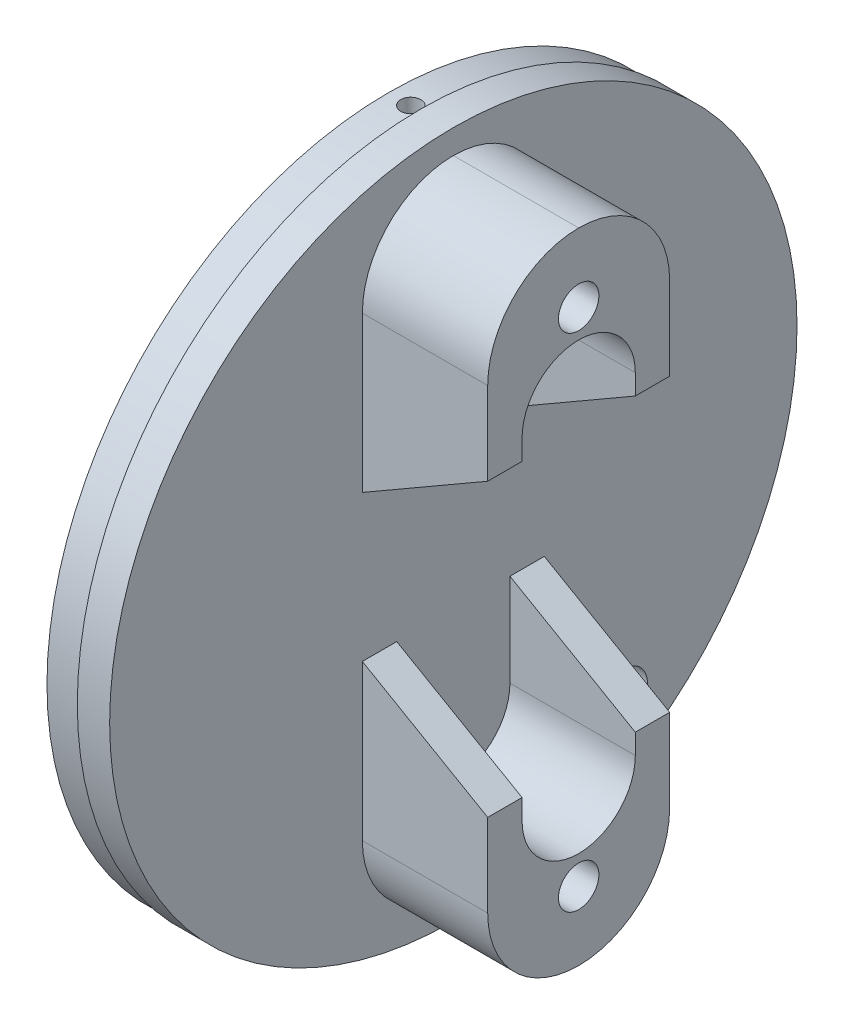
ISO-10303-21;
HEADER;
FILE_DESCRIPTION(('STEP AP214'),'2;1');
FILE_NAME('part.step','',(''),(''),'','','');
FILE_SCHEMA(('AUTOMOTIVE_DESIGN { 1 0 10303 214 1 1 1 1 }'));
ENDSEC;
DATA;
#1=APPLICATION_CONTEXT('core data for automotive mechanical design processes');
#2=APPLICATION_PROTOCOL_DEFINITION('international standard','automotive_design',2000,#1);
#3=PRODUCT_CONTEXT('',#1,'mechanical');
#4=PRODUCT('Part','Part','',(#3));
#5=PRODUCT_RELATED_PRODUCT_CATEGORY('part','',(#4));
#6=PRODUCT_DEFINITION_FORMATION('','',#4);
#7=PRODUCT_DEFINITION_CONTEXT('part definition',#1,'design');
#8=PRODUCT_DEFINITION('design','',#6,#7);
#9=PRODUCT_DEFINITION_SHAPE('','',#8);
#10=(LENGTH_UNIT() NAMED_UNIT(*) SI_UNIT(.MILLI.,.METRE.));
#11=(NAMED_UNIT(*) PLANE_ANGLE_UNIT() SI_UNIT($,.RADIAN.));
#12=(NAMED_UNIT(*) SI_UNIT($,.STERADIAN.) SOLID_ANGLE_UNIT());
#13=UNCERTAINTY_MEASURE_WITH_UNIT(LENGTH_MEASURE(1.E-05),#10,'distance_accuracy_value','');
#14=(GEOMETRIC_REPRESENTATION_CONTEXT(3) GLOBAL_UNCERTAINTY_ASSIGNED_CONTEXT((#13)) GLOBAL_UNIT_ASSIGNED_CONTEXT((#10,
#11,#12)) REPRESENTATION_CONTEXT('',''));
#15=CARTESIAN_POINT('',(0.,0.,0.));
#16=DIRECTION('',(0.,0.,1.));
#17=DIRECTION('',(1.,0.,0.));
#18=AXIS2_PLACEMENT_3D('',#15,#16,#17);
#19=CARTESIAN_POINT('',(15.5,0.,0.));
#20=DIRECTION('',(-1.,0.,0.));
#21=DIRECTION('',(0.,0.,1.));
#22=AXIS2_PLACEMENT_3D('',#19,#20,#21);
#23=PLANE('',#22);
#24=CARTESIAN_POINT('',(15.5,-31.,0.));
#25=DIRECTION('',(-1.,0.,0.));
#26=DIRECTION('',(0.,0.,1.));
#27=AXIS2_PLACEMENT_3D('',#24,#25,#26);
#28=CIRCLE('',#27,2.5);
#29=CARTESIAN_POINT('',(15.5,-31.,2.49999999999999));
#30=VERTEX_POINT('',#29);
#31=EDGE_CURVE('E215',#30,#30,#28,.T.);
#32=ORIENTED_EDGE('',*,*,#31,.T.);
#33=EDGE_LOOP('',(#32));
#34=FACE_BOUND('',#33,.T.);
#35=DIRECTION('',(0.,-1.,0.));
#36=VECTOR('',#35,1.);
#37=CARTESIAN_POINT('',(15.5,20.5,6.99999999999999));
#38=LINE('',#37,#36);
#39=CARTESIAN_POINT('',(15.5,-17.9989291724391,6.99999999999999));
#40=VERTEX_POINT('',#39);
#41=CARTESIAN_POINT('',(15.5,-20.5,6.99999999999999));
#42=VERTEX_POINT('',#41);
#43=EDGE_CURVE('E221',#40,#42,#38,.T.);
#44=ORIENTED_EDGE('',*,*,#43,.F.);
#45=DIRECTION('',(0.,0.,1.));
#46=VECTOR('',#45,1.);
#47=CARTESIAN_POINT('',(15.5,-17.9989291724392,0.));
#48=LINE('',#47,#46);
#49=CARTESIAN_POINT('',(15.5,-17.9989291724391,11.25));
#50=VERTEX_POINT('',#49);
#51=EDGE_CURVE('E348',#40,#50,#48,.T.);
#52=ORIENTED_EDGE('',*,*,#51,.T.);
#53=DIRECTION('',(0.,-1.,0.));
#54=VECTOR('',#53,1.);
#55=CARTESIAN_POINT('',(15.5,-39.5,11.25));
#56=LINE('',#55,#54);
#57=CARTESIAN_POINT('',(15.5,-28.25,11.25));
#58=VERTEX_POINT('',#57);
#59=EDGE_CURVE('E277',#50,#58,#56,.T.);
#60=ORIENTED_EDGE('',*,*,#59,.T.);
#61=CARTESIAN_POINT('',(15.5,-28.25,0.));
#62=DIRECTION('',(-1.,0.,0.));
#63=DIRECTION('',(0.,0.,1.));
#64=AXIS2_PLACEMENT_3D('',#61,#62,#63);
#65=CIRCLE('',#64,11.25);
#66=CARTESIAN_POINT('',(15.5,-39.5,0.));
#67=VERTEX_POINT('',#66);
#68=EDGE_CURVE('E320',#58,#67,#65,.F.);
#69=ORIENTED_EDGE('',*,*,#68,.T.);
#70=CARTESIAN_POINT('',(15.5,-28.25,0.));
#71=DIRECTION('',(-1.,0.,0.));
#72=DIRECTION('',(0.,0.,1.));
#73=AXIS2_PLACEMENT_3D('',#70,#71,#72);
#74=CIRCLE('',#73,11.25);
#75=CARTESIAN_POINT('',(15.5,-28.25,-11.25));
#76=VERTEX_POINT('',#75);
#77=EDGE_CURVE('E322',#67,#76,#74,.F.);
#78=ORIENTED_EDGE('',*,*,#77,.T.);
#79=DIRECTION('',(0.,1.,0.));
#80=VECTOR('',#79,1.);
#81=CARTESIAN_POINT('',(15.5,-39.5,-11.25));
#82=LINE('',#81,#80);
#83=CARTESIAN_POINT('',(15.5,-17.9989291724391,-11.25));
#84=VERTEX_POINT('',#83);
#85=EDGE_CURVE('E278',#76,#84,#82,.T.);
#86=ORIENTED_EDGE('',*,*,#85,.T.);
#87=CARTESIAN_POINT('',(15.5,-17.9989291724391,-7.));
#88=VERTEX_POINT('',#87);
#89=EDGE_CURVE('E349',#84,#88,#48,.T.);
#90=ORIENTED_EDGE('',*,*,#89,.T.);
#91=DIRECTION('',(0.,1.,0.));
#92=VECTOR('',#91,1.);
#93=CARTESIAN_POINT('',(15.5,20.5,-7.));
#94=LINE('',#93,#92);
#95=CARTESIAN_POINT('',(15.5,-20.5,-7.));
#96=VERTEX_POINT('',#95);
#97=EDGE_CURVE('E227',#96,#88,#94,.T.);
#98=ORIENTED_EDGE('',*,*,#97,.F.);
#99=CARTESIAN_POINT('',(15.5,-20.5,0.));
#100=DIRECTION('',(1.,0.,0.));
#101=DIRECTION('',(0.,0.,-1.));
#102=AXIS2_PLACEMENT_3D('',#99,#100,#101);
#103=CIRCLE('',#102,7.);
#104=EDGE_CURVE('E224',#42,#96,#103,.T.);
#105=ORIENTED_EDGE('',*,*,#104,.F.);
#106=EDGE_LOOP('',(#44,#52,#60,#69,#78,#86,#90,#98,#105));
#107=FACE_BOUND('',#106,.T.);
#108=ADVANCED_FACE('F51',(#34,#107),#23,.F.);
#109=CARTESIAN_POINT('',(15.5,31.,0.));
#110=DIRECTION('',(-1.,0.,0.));
#111=DIRECTION('',(0.,0.,1.));
#112=AXIS2_PLACEMENT_3D('',#109,#110,#111);
#113=CIRCLE('',#112,2.5);
#114=CARTESIAN_POINT('',(15.5,31.,2.49999999999999));
#115=VERTEX_POINT('',#114);
#116=EDGE_CURVE('E209',#115,#115,#113,.T.);
#117=ORIENTED_EDGE('',*,*,#116,.T.);
#118=EDGE_LOOP('',(#117));
#119=FACE_BOUND('',#118,.T.);
#120=CARTESIAN_POINT('',(15.5,20.5,6.99999999999999));
#121=VERTEX_POINT('',#120);
#122=CARTESIAN_POINT('',(15.5,17.9989291724391,6.99999999999999));
#123=VERTEX_POINT('',#122);
#124=EDGE_CURVE('E222',#121,#123,#38,.T.);
#125=ORIENTED_EDGE('',*,*,#124,.F.);
#126=CARTESIAN_POINT('',(15.5,20.5,0.));
#127=DIRECTION('',(1.,0.,0.));
#128=DIRECTION('',(0.,0.,-1.));
#129=AXIS2_PLACEMENT_3D('',#126,#127,#128);
#130=CIRCLE('',#129,7.);
#131=CARTESIAN_POINT('',(15.5,20.5,-7.));
#132=VERTEX_POINT('',#131);
#133=EDGE_CURVE('E219',#132,#121,#130,.T.);
#134=ORIENTED_EDGE('',*,*,#133,.F.);
#135=CARTESIAN_POINT('',(15.5,17.9989291724391,-7.));
#136=VERTEX_POINT('',#135);
#137=EDGE_CURVE('E226',#136,#132,#94,.T.);
#138=ORIENTED_EDGE('',*,*,#137,.F.);
#139=DIRECTION('',(0.,0.,-1.));
#140=VECTOR('',#139,1.);
#141=CARTESIAN_POINT('',(15.5,17.9989291724392,0.));
#142=LINE('',#141,#140);
#143=CARTESIAN_POINT('',(15.5,17.9989291724392,-11.25));
#144=VERTEX_POINT('',#143);
#145=EDGE_CURVE('E339',#136,#144,#142,.T.);
#146=ORIENTED_EDGE('',*,*,#145,.T.);
#147=CARTESIAN_POINT('',(15.5,28.25,-11.25));
#148=VERTEX_POINT('',#147);
#149=EDGE_CURVE('E276',#144,#148,#82,.T.);
#150=ORIENTED_EDGE('',*,*,#149,.T.);
#151=CARTESIAN_POINT('',(15.5,28.25,0.));
#152=DIRECTION('',(-1.,0.,0.));
#153=DIRECTION('',(0.,0.,1.));
#154=AXIS2_PLACEMENT_3D('',#151,#152,#153);
#155=CIRCLE('',#154,11.25);
#156=CARTESIAN_POINT('',(15.5,39.5,0.));
#157=VERTEX_POINT('',#156);
#158=EDGE_CURVE('E318',#148,#157,#155,.F.);
#159=ORIENTED_EDGE('',*,*,#158,.T.);
#160=CARTESIAN_POINT('',(15.5,28.25,0.));
#161=DIRECTION('',(-1.,0.,0.));
#162=DIRECTION('',(0.,0.,1.));
#163=AXIS2_PLACEMENT_3D('',#160,#161,#162);
#164=CIRCLE('',#163,11.25);
#165=CARTESIAN_POINT('',(15.5,28.25,11.25));
#166=VERTEX_POINT('',#165);
#167=EDGE_CURVE('E316',#157,#166,#164,.F.);
#168=ORIENTED_EDGE('',*,*,#167,.T.);
#169=CARTESIAN_POINT('',(15.5,17.9989291724391,11.25));
#170=VERTEX_POINT('',#169);
#171=EDGE_CURVE('E273',#166,#170,#56,.T.);
#172=ORIENTED_EDGE('',*,*,#171,.T.);
#173=EDGE_CURVE('E345',#170,#123,#142,.T.);
#174=ORIENTED_EDGE('',*,*,#173,.T.);
#175=EDGE_LOOP('',(#125,#134,#138,#146,#150,#159,#168,#172,#174));
#176=FACE_BOUND('',#175,.T.);
#177=ADVANCED_FACE('F394',(#119,#176),#23,.F.);
#178=CARTESIAN_POINT('',(15.5,-17.9989291724391,-42.5));
#179=DIRECTION('',(-0.499999999999998,-0.86602540378444,0.));
#180=DIRECTION('',(0.86602540378444,-0.499999999999998,0.));
#181=AXIS2_PLACEMENT_3D('',#178,#179,#180);
#182=PLANE('',#181);
#183=DIRECTION('',(0.86602540378444,-0.499999999999998,0.));
#184=VECTOR('',#183,1.);
#185=CARTESIAN_POINT('',(15.5,-17.9989291724391,6.99999999999999));
#186=LINE('',#185,#184);
#187=CARTESIAN_POINT('',(0.,-9.05,6.99999999999999));
#188=VERTEX_POINT('',#187);
#189=EDGE_CURVE('E250',#188,#40,#186,.T.);
#190=ORIENTED_EDGE('',*,*,#189,.F.);
#191=DIRECTION('',(0.,0.,1.));
#192=VECTOR('',#191,1.);
#193=CARTESIAN_POINT('',(0.,-9.05,-42.5));
#194=LINE('',#193,#192);
#195=CARTESIAN_POINT('',(0.,-9.05,11.25));
#196=VERTEX_POINT('',#195);
#197=EDGE_CURVE('E257',#188,#196,#194,.T.);
#198=ORIENTED_EDGE('',*,*,#197,.T.);
#199=DIRECTION('',(-0.86602540378444,0.499999999999998,0.));
#200=VECTOR('',#199,1.);
#201=CARTESIAN_POINT('',(24.810236772618,-23.3741968793293,11.25));
#202=LINE('',#201,#200);
#203=EDGE_CURVE('E269',#50,#196,#202,.T.);
#204=ORIENTED_EDGE('',*,*,#203,.F.);
#205=ORIENTED_EDGE('',*,*,#51,.F.);
#206=EDGE_LOOP('',(#190,#198,#204,#205));
#207=FACE_BOUND('',#206,.T.);
#208=ADVANCED_FACE('F399',(#207),#182,.F.);
#209=DIRECTION('',(-0.86602540378444,0.499999999999998,0.));
#210=VECTOR('',#209,1.);
#211=CARTESIAN_POINT('',(15.5,-17.9989291724391,-7.00000000000001));
#212=LINE('',#211,#210);
#213=CARTESIAN_POINT('',(0.,-9.05,-7.00000000000001));
#214=VERTEX_POINT('',#213);
#215=EDGE_CURVE('E248',#88,#214,#212,.T.);
#216=ORIENTED_EDGE('',*,*,#215,.F.);
#217=ORIENTED_EDGE('',*,*,#89,.F.);
#218=DIRECTION('',(0.86602540378444,-0.499999999999998,0.));
#219=VECTOR('',#218,1.);
#220=CARTESIAN_POINT('',(24.810236772618,-23.3741968793293,-11.25));
#221=LINE('',#220,#219);
#222=CARTESIAN_POINT('',(0.,-9.05,-11.25));
#223=VERTEX_POINT('',#222);
#224=EDGE_CURVE('E266',#223,#84,#221,.T.);
#225=ORIENTED_EDGE('',*,*,#224,.F.);
#226=EDGE_CURVE('E253',#223,#214,#194,.T.);
#227=ORIENTED_EDGE('',*,*,#226,.T.);
#228=EDGE_LOOP('',(#216,#217,#225,#227));
#229=FACE_BOUND('',#228,.T.);
#230=ADVANCED_FACE('F423',(#229),#182,.F.);
#231=CARTESIAN_POINT('',(0.,9.05,-42.5));
#232=DIRECTION('',(-0.499999999999998,0.86602540378444,0.));
#233=DIRECTION('',(-0.86602540378444,-0.499999999999998,0.));
#234=AXIS2_PLACEMENT_3D('',#231,#232,#233);
#235=PLANE('',#234);
#236=DIRECTION('',(-0.86602540378444,-0.499999999999998,0.));
#237=VECTOR('',#236,1.);
#238=CARTESIAN_POINT('',(0.,9.05,6.99999999999999));
#239=LINE('',#238,#237);
#240=CARTESIAN_POINT('',(0.,9.05,6.99999999999999));
#241=VERTEX_POINT('',#240);
#242=EDGE_CURVE('E64',#123,#241,#239,.T.);
#243=ORIENTED_EDGE('',*,*,#242,.F.);
#244=ORIENTED_EDGE('',*,*,#173,.F.);
#245=DIRECTION('',(0.86602540378444,0.499999999999998,0.));
#246=VECTOR('',#245,1.);
#247=CARTESIAN_POINT('',(-9.39776667686721,3.62419687932946,11.25));
#248=LINE('',#247,#246);
#249=CARTESIAN_POINT('',(0.,9.05,11.25));
#250=VERTEX_POINT('',#249);
#251=EDGE_CURVE('E263',#250,#170,#248,.T.);
#252=ORIENTED_EDGE('',*,*,#251,.F.);
#253=DIRECTION('',(0.,0.,1.));
#254=VECTOR('',#253,1.);
#255=CARTESIAN_POINT('',(0.,9.05,-42.5));
#256=LINE('',#255,#254);
#257=EDGE_CURVE('E252',#241,#250,#256,.T.);
#258=ORIENTED_EDGE('',*,*,#257,.F.);
#259=EDGE_LOOP('',(#243,#244,#252,#258));
#260=FACE_BOUND('',#259,.T.);
#261=ADVANCED_FACE('F425',(#260),#235,.F.);
#262=DIRECTION('',(0.86602540378444,0.499999999999998,0.));
#263=VECTOR('',#262,1.);
#264=CARTESIAN_POINT('',(0.,9.05,-7.00000000000001));
#265=LINE('',#264,#263);
#266=CARTESIAN_POINT('',(0.,9.05,-7.));
#267=VERTEX_POINT('',#266);
#268=EDGE_CURVE('E352',#267,#136,#265,.T.);
#269=ORIENTED_EDGE('',*,*,#268,.F.);
#270=CARTESIAN_POINT('',(0.,9.05,-11.25));
#271=VERTEX_POINT('',#270);
#272=EDGE_CURVE('E258',#271,#267,#256,.T.);
#273=ORIENTED_EDGE('',*,*,#272,.F.);
#274=DIRECTION('',(-0.86602540378444,-0.499999999999998,0.));
#275=VECTOR('',#274,1.);
#276=CARTESIAN_POINT('',(-9.39776667686721,3.62419687932946,-11.25));
#277=LINE('',#276,#275);
#278=EDGE_CURVE('E256',#144,#271,#277,.T.);
#279=ORIENTED_EDGE('',*,*,#278,.F.);
#280=ORIENTED_EDGE('',*,*,#145,.F.);
#281=EDGE_LOOP('',(#269,#273,#279,#280));
#282=FACE_BOUND('',#281,.T.);
#283=ADVANCED_FACE('F428',(#282),#235,.F.);
#284=CARTESIAN_POINT('',(15.5,-39.5,11.25));
#285=DIRECTION('',(0.,0.,-1.));
#286=DIRECTION('',(-1.,0.,0.));
#287=AXIS2_PLACEMENT_3D('',#284,#285,#286);
#288=PLANE('',#287);
#289=ORIENTED_EDGE('',*,*,#59,.F.);
#290=ORIENTED_EDGE('',*,*,#203,.T.);
#291=DIRECTION('',(0.,-1.,0.));
#292=VECTOR('',#291,1.);
#293=CARTESIAN_POINT('',(0.,-39.5,11.25));
#294=LINE('',#293,#292);
#295=CARTESIAN_POINT('',(0.,-28.25,11.25));
#296=VERTEX_POINT('',#295);
#297=EDGE_CURVE('E286',#196,#296,#294,.T.);
#298=ORIENTED_EDGE('',*,*,#297,.T.);
#299=DIRECTION('',(-1.,0.,0.));
#300=VECTOR('',#299,1.);
#301=CARTESIAN_POINT('',(15.5,-28.25,11.25));
#302=LINE('',#301,#300);
#303=EDGE_CURVE('E326',#296,#58,#302,.F.);
#304=ORIENTED_EDGE('',*,*,#303,.T.);
#305=EDGE_LOOP('',(#289,#290,#298,#304));
#306=FACE_BOUND('',#305,.T.);
#307=ADVANCED_FACE('F386',(#306),#288,.F.);
#308=CARTESIAN_POINT('',(15.5,-39.5,-11.25));
#309=DIRECTION('',(0.,0.,1.));
#310=DIRECTION('',(1.,0.,0.));
#311=AXIS2_PLACEMENT_3D('',#308,#309,#310);
#312=PLANE('',#311);
#313=DIRECTION('',(0.,1.,0.));
#314=VECTOR('',#313,1.);
#315=CARTESIAN_POINT('',(0.,-39.5,-11.25));
#316=LINE('',#315,#314);
#317=CARTESIAN_POINT('',(0.,-28.25,-11.25));
#318=VERTEX_POINT('',#317);
#319=EDGE_CURVE('E287',#318,#223,#316,.T.);
#320=ORIENTED_EDGE('',*,*,#319,.T.);
#321=ORIENTED_EDGE('',*,*,#224,.T.);
#322=ORIENTED_EDGE('',*,*,#85,.F.);
#323=DIRECTION('',(-1.,0.,0.));
#324=VECTOR('',#323,1.);
#325=CARTESIAN_POINT('',(15.5,-28.25,-11.25));
#326=LINE('',#325,#324);
#327=EDGE_CURVE('E313',#76,#318,#326,.T.);
#328=ORIENTED_EDGE('',*,*,#327,.T.);
#329=EDGE_LOOP('',(#320,#321,#322,#328));
#330=FACE_BOUND('',#329,.T.);
#331=ADVANCED_FACE('F376',(#330),#312,.F.);
#332=CARTESIAN_POINT('',(-714.885574261404,0.,0.));
#333=DIRECTION('',(-1.,0.,0.));
#334=DIRECTION('',(0.,0.,1.));
#335=AXIS2_PLACEMENT_3D('',#332,#333,#334);
#336=CYLINDRICAL_SURFACE('',#335,42.5);
#337=CARTESIAN_POINT('',(-4.,0.,0.));
#338=DIRECTION('',(-1.,0.,0.));
#339=DIRECTION('',(0.,0.,1.));
#340=AXIS2_PLACEMENT_3D('',#337,#338,#339);
#341=CIRCLE('',#340,42.5);
#342=CARTESIAN_POINT('',(-4.,0.,42.5));
#343=VERTEX_POINT('',#342);
#344=EDGE_CURVE('E292',#343,#343,#341,.T.);
#345=ORIENTED_EDGE('',*,*,#344,.F.);
#346=EDGE_LOOP('',(#345));
#347=FACE_BOUND('',#346,.T.);
#348=CARTESIAN_POINT('',(0.,0.,0.));
#349=DIRECTION('',(1.,0.,0.));
#350=DIRECTION('',(0.,0.,-1.));
#351=AXIS2_PLACEMENT_3D('',#348,#349,#350);
#352=CIRCLE('',#351,42.5);
#353=CARTESIAN_POINT('',(0.,0.,-42.5));
#354=VERTEX_POINT('',#353);
#355=EDGE_CURVE('E281',#354,#354,#352,.T.);
#356=ORIENTED_EDGE('',*,*,#355,.F.);
#357=EDGE_LOOP('',(#356));
#358=FACE_BOUND('',#357,.T.);
#359=ADVANCED_FACE('F373',(#347,#358),#336,.T.);
#360=CARTESIAN_POINT('',(-8.00000000000004,16.,0.));
#361=DIRECTION('',(1.,0.,0.));
#362=DIRECTION('',(0.,0.,-1.));
#363=AXIS2_PLACEMENT_3D('',#360,#361,#362);
#364=PLANE('',#363);
#365=CARTESIAN_POINT('',(-8.00000000000004,-29.,-21.));
#366=DIRECTION('',(-1.,0.,0.));
#367=DIRECTION('',(0.,0.,1.));
#368=AXIS2_PLACEMENT_3D('',#365,#366,#367);
#369=CIRCLE('',#368,3.);
#370=CARTESIAN_POINT('',(-8.00000000000004,-29.,-18.));
#371=VERTEX_POINT('',#370);
#372=EDGE_CURVE('E196',#371,#371,#369,.T.);
#373=ORIENTED_EDGE('',*,*,#372,.F.);
#374=EDGE_LOOP('',(#373));
#375=FACE_BOUND('',#374,.T.);
#376=CARTESIAN_POINT('',(-8.00000000000004,20.5,0.));
#377=DIRECTION('',(1.,0.,0.));
#378=DIRECTION('',(0.,0.,-1.));
#379=AXIS2_PLACEMENT_3D('',#376,#377,#378);
#380=CIRCLE('',#379,6.5);
#381=CARTESIAN_POINT('',(-8.00000000000004,20.5,-6.5));
#382=VERTEX_POINT('',#381);
#383=EDGE_CURVE('E307',#382,#382,#380,.T.);
#384=ORIENTED_EDGE('',*,*,#383,.T.);
#385=EDGE_LOOP('',(#384));
#386=FACE_BOUND('',#385,.T.);
#387=CARTESIAN_POINT('',(-8.00000000000001,0.,0.));
#388=DIRECTION('',(-1.,0.,0.));
#389=DIRECTION('',(0.,0.,1.));
#390=AXIS2_PLACEMENT_3D('',#387,#388,#389);
#391=CIRCLE('',#390,42.25);
#392=CARTESIAN_POINT('',(-8.00000000000001,0.,42.25));
#393=VERTEX_POINT('',#392);
#394=EDGE_CURVE('E298',#393,#393,#391,.T.);
#395=ORIENTED_EDGE('',*,*,#394,.T.);
#396=EDGE_LOOP('',(#395));
#397=FACE_BOUND('',#396,.T.);
#398=ADVANCED_FACE('F375',(#375,#386,#397),#364,.F.);
#399=CARTESIAN_POINT('',(-1017.,20.5,0.));
#400=DIRECTION('',(-1.,0.,0.));
#401=DIRECTION('',(0.,0.,1.));
#402=AXIS2_PLACEMENT_3D('',#399,#400,#401);
#403=CYLINDRICAL_SURFACE('',#402,4.5);
#404=CARTESIAN_POINT('',(-10.,20.5,0.));
#405=DIRECTION('',(1.,0.,0.));
#406=DIRECTION('',(0.,0.,-1.));
#407=AXIS2_PLACEMENT_3D('',#404,#405,#406);
#408=CIRCLE('',#407,4.5);
#409=CARTESIAN_POINT('',(-10.,20.5,-4.5));
#410=VERTEX_POINT('',#409);
#411=EDGE_CURVE('E304',#410,#410,#408,.F.);
#412=ORIENTED_EDGE('',*,*,#411,.T.);
#413=EDGE_LOOP('',(#412));
#414=FACE_BOUND('',#413,.T.);
#415=CARTESIAN_POINT('',(-17.,20.5,0.));
#416=DIRECTION('',(-1.,0.,0.));
#417=DIRECTION('',(0.,0.,1.));
#418=AXIS2_PLACEMENT_3D('',#415,#416,#417);
#419=CIRCLE('',#418,4.5);
#420=CARTESIAN_POINT('',(-17.,20.5,4.5));
#421=VERTEX_POINT('',#420);
#422=EDGE_CURVE('E301',#421,#421,#419,.T.);
#423=ORIENTED_EDGE('',*,*,#422,.F.);
#424=EDGE_LOOP('',(#423));
#425=FACE_BOUND('',#424,.T.);
#426=ADVANCED_FACE('F383',(#414,#425),#403,.T.);
#427=CARTESIAN_POINT('',(-17.,0.,0.));
#428=DIRECTION('',(1.,0.,0.));
#429=DIRECTION('',(0.,0.,-1.));
#430=AXIS2_PLACEMENT_3D('',#427,#428,#429);
#431=PLANE('',#430);
#432=CARTESIAN_POINT('',(-17.,20.5,0.));
#433=DIRECTION('',(-1.,0.,0.));
#434=DIRECTION('',(0.,0.,1.));
#435=AXIS2_PLACEMENT_3D('',#432,#433,#434);
#436=CIRCLE('',#435,1.65);
#437=CARTESIAN_POINT('',(-17.,20.5,1.65));
#438=VERTEX_POINT('',#437);
#439=EDGE_CURVE('E202',#438,#438,#436,.T.);
#440=ORIENTED_EDGE('',*,*,#439,.F.);
#441=EDGE_LOOP('',(#440));
#442=FACE_BOUND('',#441,.T.);
#443=ORIENTED_EDGE('',*,*,#422,.T.);
#444=EDGE_LOOP('',(#443));
#445=FACE_BOUND('',#444,.T.);
#446=ADVANCED_FACE('F404',(#442,#445),#431,.F.);
#447=CARTESIAN_POINT('',(-10.,20.5,0.));
#448=DIRECTION('',(1.,0.,0.));
#449=DIRECTION('',(0.,0.,-1.));
#450=AXIS2_PLACEMENT_3D('',#447,#448,#449);
#451=TOROIDAL_SURFACE('',#450,6.5,2.);
#452=ORIENTED_EDGE('',*,*,#383,.F.);
#453=EDGE_LOOP('',(#452));
#454=FACE_BOUND('',#453,.T.);
#455=ORIENTED_EDGE('',*,*,#411,.F.);
#456=EDGE_LOOP('',(#455));
#457=FACE_BOUND('',#456,.T.);
#458=ADVANCED_FACE('F410',(#454,#457),#451,.F.);
#459=CARTESIAN_POINT('',(-1000.,0.,0.));
#460=DIRECTION('',(-1.,0.,0.));
#461=DIRECTION('',(0.,0.,1.));
#462=AXIS2_PLACEMENT_3D('',#459,#460,#461);
#463=CYLINDRICAL_SURFACE('',#462,42.25);
#464=CARTESIAN_POINT('',(-4.,42.25,0.));
#465=CARTESIAN_POINT('',(-4.00000310788172,42.2499997508496,-0.0701965689448525));
#466=CARTESIAN_POINT('',(-4.00593291760932,42.2498231803283,-0.140443645930583));
#467=CARTESIAN_POINT('',(-4.02950518504546,42.2491357798871,-0.279002028584804));
#468=CARTESIAN_POINT('',(-4.04716163652588,42.2486245506189,-0.347310919680379));
#469=CARTESIAN_POINT('',(-4.09368309495641,42.2473257285401,-0.479965589333422));
#470=CARTESIAN_POINT('',(-4.12254262233644,42.2465382708545,-0.544313287562788));
#471=CARTESIAN_POINT('',(-4.19064316667275,42.2447758175827,-0.66723266967503));
#472=CARTESIAN_POINT('',(-4.22988164807603,42.2438008678162,-0.725805759489601));
#473=CARTESIAN_POINT('',(-4.31764688691388,42.241772722151,-0.835557484223929));
#474=CARTESIAN_POINT('',(-4.36617714815248,42.2407194968276,-0.886733316922135));
#475=CARTESIAN_POINT('',(-4.47114227852571,42.2386537649071,-0.980214275034548));
#476=CARTESIAN_POINT('',(-4.52757746220523,42.2376412599323,-1.0225190472929));
#477=CARTESIAN_POINT('',(-4.6467606896827,42.235771002964,-1.09706125658326));
#478=CARTESIAN_POINT('',(-4.70950977330255,42.2349132765258,-1.12929703177531));
#479=CARTESIAN_POINT('',(-4.83953216710106,42.2334495656459,-1.18277536520727));
#480=CARTESIAN_POINT('',(-4.90680545937857,42.2328435802082,-1.20401796694146));
#481=CARTESIAN_POINT('',(-5.04394565171449,42.2319518930541,-1.23490098588688));
#482=CARTESIAN_POINT('',(-5.11381178147674,42.2316660969884,-1.24454482093372));
#483=CARTESIAN_POINT('',(-5.25417183450939,42.2314467294612,-1.25196708057046));
#484=CARTESIAN_POINT('',(-5.3246657553103,42.2315131566149,-1.24974555181376));
#485=CARTESIAN_POINT('',(-5.46425713748476,42.2319906567979,-1.23350303874063));
#486=CARTESIAN_POINT('',(-5.53335502935515,42.2324016218672,-1.21948575058753));
#487=CARTESIAN_POINT('',(-5.66821647832321,42.2335216998328,-1.18005533462313));
#488=CARTESIAN_POINT('',(-5.73398002818506,42.2342308133761,-1.15464218208294));
#489=CARTESIAN_POINT('',(-5.86031788444766,42.2358673747993,-1.09313718398819));
#490=CARTESIAN_POINT('',(-5.92089136561908,42.2367948573127,-1.05704364428298));
#491=CARTESIAN_POINT('',(-6.03512056342475,42.2387635648866,-0.975203698557491));
#492=CARTESIAN_POINT('',(-6.08877626476317,42.2398047901987,-0.929457271194395));
#493=CARTESIAN_POINT('',(-6.18766834811509,42.2418840864903,-0.829589214288357));
#494=CARTESIAN_POINT('',(-6.23290149306829,42.2429221561067,-0.775464379228466));
#495=CARTESIAN_POINT('',(-6.31363953146802,42.2448777333896,-0.660387226923741));
#496=CARTESIAN_POINT('',(-6.3491444233473,42.2457952410365,-0.599434908578988));
#497=CARTESIAN_POINT('',(-6.40941773202253,42.2474062784324,-0.472431216611692));
#498=CARTESIAN_POINT('',(-6.43418604725617,42.2480998060626,-0.4063797947613));
#499=CARTESIAN_POINT('',(-6.47228105071997,42.249184670388,-0.271053675299346));
#500=CARTESIAN_POINT('',(-6.48560776925514,42.2495760078835,-0.201778986225663));
#501=CARTESIAN_POINT('',(-6.50043731448921,42.25001227608,-0.0620009263782428));
#502=CARTESIAN_POINT('',(-6.50194462004265,42.2500573379986,0.00850196882717335));
#503=CARTESIAN_POINT('',(-6.49310422367055,42.249796323014,0.148759811289308));
#504=CARTESIAN_POINT('',(-6.48275653509168,42.2494902465063,0.218514759387996));
#505=CARTESIAN_POINT('',(-6.45050359166212,42.2485615348425,0.355284121488675));
#506=CARTESIAN_POINT('',(-6.42860037017491,42.2479389553806,0.422299015408173));
#507=CARTESIAN_POINT('',(-6.37386018036968,42.246447394175,0.551700683352557));
#508=CARTESIAN_POINT('',(-6.34102319073515,42.2455784119511,0.614087448354131));
#509=CARTESIAN_POINT('',(-6.26533605795955,42.2436916126367,0.732482533446539));
#510=CARTESIAN_POINT('',(-6.22248290048668,42.2426737507759,0.78848892582387));
#511=CARTESIAN_POINT('',(-6.12798430484172,42.2406040554348,0.892514084882584));
#512=CARTESIAN_POINT('',(-6.0763388447217,42.2395522218696,0.940532831624101));
#513=CARTESIAN_POINT('',(-5.96570248319632,42.2375327861983,1.02723456912516));
#514=CARTESIAN_POINT('',(-5.90670931630027,42.236565210228,1.06591466967981));
#515=CARTESIAN_POINT('',(-5.78306371523946,42.2348237914473,1.13282136118448));
#516=CARTESIAN_POINT('',(-5.7184112936379,42.2340499482068,1.16104797533986));
#517=CARTESIAN_POINT('',(-5.5852933133752,42.2327834309011,1.20624138272467));
#518=CARTESIAN_POINT('',(-5.51682839031089,42.232290710122,1.22321004675498));
#519=CARTESIAN_POINT('',(-5.37801986313499,42.2316418596499,1.24541200952474));
#520=CARTESIAN_POINT('',(-5.30767626053848,42.2314857296855,1.25064531772794));
#521=CARTESIAN_POINT('',(-5.16713611939083,42.2315276810117,1.24922779595364));
#522=CARTESIAN_POINT('',(-5.09693953476585,42.2317256264077,1.2425815253727));
#523=CARTESIAN_POINT('',(-4.95865898768618,42.2324531281373,1.2176028837221));
#524=CARTESIAN_POINT('',(-4.89057502942162,42.2329826851284,1.19927048947603));
#525=CARTESIAN_POINT('',(-4.75845060979864,42.2343136925974,1.15144060236367));
#526=CARTESIAN_POINT('',(-4.69441021633616,42.2351151476393,1.12194292207796));
#527=CARTESIAN_POINT('',(-4.5721920406582,42.2368995673016,1.05262140384099));
#528=CARTESIAN_POINT('',(-4.51401404604093,42.2378825253423,1.01279794019227));
#529=CARTESIAN_POINT('',(-4.40515127071781,42.2399195192912,0.923942028100889));
#530=CARTESIAN_POINT('',(-4.35446857186892,42.2409735748292,0.874907029660887));
#531=CARTESIAN_POINT('',(-4.26204079371808,42.2430340062932,0.769009948165132));
#532=CARTESIAN_POINT('',(-4.2202979308274,42.2440403703472,0.712145929825043));
#533=CARTESIAN_POINT('',(-4.1469278469671,42.2458923191545,0.592183063176233));
#534=CARTESIAN_POINT('',(-4.11530715316131,42.2467378000222,0.529080226020922));
#535=CARTESIAN_POINT('',(-4.06314577920988,42.2481708087843,0.398507631059076));
#536=CARTESIAN_POINT('',(-4.0425918845341,42.2487586441686,0.331043189663896));
#537=CARTESIAN_POINT('',(-4.01859537320425,42.2494529929848,0.219293737761477));
#538=CARTESIAN_POINT('',(-4.01163088056802,42.2496572307493,0.175734091850095));
#539=CARTESIAN_POINT('',(-4.0023322190201,42.2499308124494,0.0881229334312929));
#540=CARTESIAN_POINT('',(-3.99999804878265,42.2500001564238,0.0440714210647098));
#541=CARTESIAN_POINT('',(-4.,42.25,0.));
#542=B_SPLINE_CURVE_WITH_KNOTS('',3,(#464,#465,#466,#467,#468,#469,#470,#471,#472,#473,#474,
#475,#476,#477,#478,#479,#480,#481,#482,#483,#484,#485,#486,#487,#488,#489,#490,#491,#492,#493,
#494,#495,#496,#497,#498,#499,#500,#501,#502,#503,#504,#505,#506,#507,#508,#509,#510,#511,#512,
#513,#514,#515,#516,#517,#518,#519,#520,#521,#522,#523,#524,#525,#526,#527,#528,#529,#530,#531,
#532,#533,#534,#535,#536,#537,#538,#539,#540,#541),.UNSPECIFIED.,.T.,.F.,(4,2,2,2,2,2,2,2,2,2,2,
2,2,2,2,2,2,2,2,2,2,2,2,2,2,2,2,2,2,2,2,2,2,2,2,2,2,2,4),(0.,0.210428840574202,
0.421109244802186,0.631686732078324,0.842212823227841,1.05281845781901,1.26343247500414,
1.47408123468333,1.68472916092802,1.89531499983749,2.10590001074591,2.31641906007748,
2.52693856623502,2.73749148345826,2.94804486622505,3.15867900517499,3.3693131780585,
3.57994934338595,3.79058495080622,4.00114073600032,4.21169628414531,4.42221479434186,
4.63273371496871,4.84331607231173,5.0538989553317,5.26454692805641,5.47519443316764,
5.68580692494997,5.8964192468881,6.10695075292103,6.31748267649033,6.52801813418502,
6.73854596118076,6.94913215397858,7.15977049613067,7.37054439364342,7.58106605110914,
7.71317935567432,7.84529262241233),.UNSPECIFIED.);
#543=CARTESIAN_POINT('',(-4.00000000000002,42.25,0.));
#544=VERTEX_POINT('',#543);
#545=EDGE_CURVE('E13',#544,#544,#542,.T.);
#546=ORIENTED_EDGE('',*,*,#545,.F.);
#547=CARTESIAN_POINT('',(-4.,0.,0.));
#548=DIRECTION('',(-1.,0.,0.));
#549=DIRECTION('',(0.,0.,1.));
#550=AXIS2_PLACEMENT_3D('',#547,#548,#549);
#551=CIRCLE('',#550,42.25);
#552=EDGE_CURVE('E295',#544,#544,#551,.T.);
#553=ORIENTED_EDGE('',*,*,#552,.T.);
#554=EDGE_LOOP('',(#546,#553));
#555=FACE_BOUND('',#554,.T.);
#556=ORIENTED_EDGE('',*,*,#394,.F.);
#557=EDGE_LOOP('',(#556));
#558=FACE_BOUND('',#557,.T.);
#559=ADVANCED_FACE('F406',(#555,#558),#463,.T.);
#560=CARTESIAN_POINT('',(-4.00000000000001,42.5,0.));
#561=DIRECTION('',(-1.,0.,0.));
#562=DIRECTION('',(0.,0.,1.));
#563=AXIS2_PLACEMENT_3D('',#560,#561,#562);
#564=PLANE('',#563);
#565=ORIENTED_EDGE('',*,*,#344,.T.);
#566=EDGE_LOOP('',(#565));
#567=FACE_BOUND('',#566,.T.);
#568=ORIENTED_EDGE('',*,*,#552,.F.);
#569=EDGE_LOOP('',(#568));
#570=FACE_BOUND('',#569,.T.);
#571=ADVANCED_FACE('F365',(#567,#570),#564,.T.);
#572=CARTESIAN_POINT('',(0.,0.,0.));
#573=DIRECTION('',(1.,0.,0.));
#574=DIRECTION('',(0.,0.,-1.));
#575=AXIS2_PLACEMENT_3D('',#572,#573,#574);
#576=PLANE('',#575);
#577=CARTESIAN_POINT('',(0.,-29.,-21.));
#578=DIRECTION('',(1.,0.,0.));
#579=DIRECTION('',(0.,0.,-1.));
#580=AXIS2_PLACEMENT_3D('',#577,#578,#579);
#581=CIRCLE('',#580,3.);
#582=CARTESIAN_POINT('',(0.,-29.,-24.));
#583=VERTEX_POINT('',#582);
#584=EDGE_CURVE('E199',#583,#583,#581,.T.);
#585=ORIENTED_EDGE('',*,*,#584,.F.);
#586=EDGE_LOOP('',(#585));
#587=FACE_BOUND('',#586,.T.);
#588=CARTESIAN_POINT('',(0.,20.5,0.));
#589=DIRECTION('',(1.,0.,0.));
#590=DIRECTION('',(0.,0.,-1.));
#591=AXIS2_PLACEMENT_3D('',#588,#589,#590);
#592=CIRCLE('',#591,1.65);
#593=CARTESIAN_POINT('',(0.,20.5,-1.65));
#594=VERTEX_POINT('',#593);
#595=EDGE_CURVE('E205',#594,#594,#592,.T.);
#596=ORIENTED_EDGE('',*,*,#595,.F.);
#597=EDGE_LOOP('',(#596));
#598=FACE_BOUND('',#597,.T.);
#599=DIRECTION('',(0.,-1.,0.));
#600=VECTOR('',#599,1.);
#601=CARTESIAN_POINT('',(0.,20.5,6.99999999999999));
#602=LINE('',#601,#600);
#603=CARTESIAN_POINT('',(0.,20.5,6.99999999999999));
#604=VERTEX_POINT('',#603);
#605=EDGE_CURVE('E79',#604,#241,#602,.T.);
#606=ORIENTED_EDGE('',*,*,#605,.T.);
#607=ORIENTED_EDGE('',*,*,#257,.T.);
#608=CARTESIAN_POINT('',(0.,28.25,11.25));
#609=VERTEX_POINT('',#608);
#610=EDGE_CURVE('E282',#609,#250,#294,.T.);
#611=ORIENTED_EDGE('',*,*,#610,.F.);
#612=CARTESIAN_POINT('',(0.,28.25,0.));
#613=DIRECTION('',(1.,0.,0.));
#614=DIRECTION('',(0.,0.,-1.));
#615=AXIS2_PLACEMENT_3D('',#612,#613,#614);
#616=CIRCLE('',#615,11.25);
#617=CARTESIAN_POINT('',(0.,39.5,0.));
#618=VERTEX_POINT('',#617);
#619=EDGE_CURVE('E337',#609,#618,#616,.F.);
#620=ORIENTED_EDGE('',*,*,#619,.T.);
#621=CARTESIAN_POINT('',(0.,28.25,0.));
#622=DIRECTION('',(1.,0.,0.));
#623=DIRECTION('',(0.,0.,-1.));
#624=AXIS2_PLACEMENT_3D('',#621,#622,#623);
#625=CIRCLE('',#624,11.25);
#626=CARTESIAN_POINT('',(0.,28.25,-11.25));
#627=VERTEX_POINT('',#626);
#628=EDGE_CURVE('E334',#618,#627,#625,.F.);
#629=ORIENTED_EDGE('',*,*,#628,.T.);
#630=EDGE_CURVE('E285',#271,#627,#316,.T.);
#631=ORIENTED_EDGE('',*,*,#630,.F.);
#632=ORIENTED_EDGE('',*,*,#272,.T.);
#633=DIRECTION('',(0.,1.,0.));
#634=VECTOR('',#633,1.);
#635=CARTESIAN_POINT('',(0.,20.5,-7.));
#636=LINE('',#635,#634);
#637=CARTESIAN_POINT('',(0.,20.5,-7.));
#638=VERTEX_POINT('',#637);
#639=EDGE_CURVE('E235',#267,#638,#636,.T.);
#640=ORIENTED_EDGE('',*,*,#639,.T.);
#641=CARTESIAN_POINT('',(0.,20.5,0.));
#642=DIRECTION('',(1.,0.,0.));
#643=DIRECTION('',(0.,0.,-1.));
#644=AXIS2_PLACEMENT_3D('',#641,#642,#643);
#645=CIRCLE('',#644,7.);
#646=EDGE_CURVE('E218',#638,#604,#645,.T.);
#647=ORIENTED_EDGE('',*,*,#646,.T.);
#648=EDGE_LOOP('',(#606,#607,#611,#620,#629,#631,#632,#640,#647));
#649=FACE_BOUND('',#648,.T.);
#650=ORIENTED_EDGE('',*,*,#197,.F.);
#651=CARTESIAN_POINT('',(0.,-20.5,6.99999999999999));
#652=VERTEX_POINT('',#651);
#653=EDGE_CURVE('E231',#188,#652,#602,.T.);
#654=ORIENTED_EDGE('',*,*,#653,.T.);
#655=CARTESIAN_POINT('',(0.,-20.5,0.));
#656=DIRECTION('',(1.,0.,0.));
#657=DIRECTION('',(0.,0.,-1.));
#658=AXIS2_PLACEMENT_3D('',#655,#656,#657);
#659=CIRCLE('',#658,7.);
#660=CARTESIAN_POINT('',(0.,-20.5,-7.));
#661=VERTEX_POINT('',#660);
#662=EDGE_CURVE('E233',#652,#661,#659,.T.);
#663=ORIENTED_EDGE('',*,*,#662,.T.);
#664=EDGE_CURVE('E71',#661,#214,#636,.T.);
#665=ORIENTED_EDGE('',*,*,#664,.T.);
#666=ORIENTED_EDGE('',*,*,#226,.F.);
#667=ORIENTED_EDGE('',*,*,#319,.F.);
#668=CARTESIAN_POINT('',(0.,-28.25,0.));
#669=DIRECTION('',(1.,0.,0.));
#670=DIRECTION('',(0.,0.,-1.));
#671=AXIS2_PLACEMENT_3D('',#668,#669,#670);
#672=CIRCLE('',#671,11.25);
#673=CARTESIAN_POINT('',(0.,-39.5,0.));
#674=VERTEX_POINT('',#673);
#675=EDGE_CURVE('E329',#318,#674,#672,.F.);
#676=ORIENTED_EDGE('',*,*,#675,.T.);
#677=CARTESIAN_POINT('',(0.,-28.25,0.));
#678=DIRECTION('',(1.,0.,0.));
#679=DIRECTION('',(0.,0.,-1.));
#680=AXIS2_PLACEMENT_3D('',#677,#678,#679);
#681=CIRCLE('',#680,11.25);
#682=EDGE_CURVE('E331',#674,#296,#681,.F.);
#683=ORIENTED_EDGE('',*,*,#682,.T.);
#684=ORIENTED_EDGE('',*,*,#297,.F.);
#685=EDGE_LOOP('',(#650,#654,#663,#665,#666,#667,#676,#683,#684));
#686=FACE_BOUND('',#685,.T.);
#687=ORIENTED_EDGE('',*,*,#355,.T.);
#688=EDGE_LOOP('',(#687));
#689=FACE_BOUND('',#688,.T.);
#690=ADVANCED_FACE('F361',(#587,#598,#649,#686,#689),#576,.T.);
#691=ORIENTED_EDGE('',*,*,#610,.T.);
#692=ORIENTED_EDGE('',*,*,#251,.T.);
#693=ORIENTED_EDGE('',*,*,#171,.F.);
#694=DIRECTION('',(-1.,0.,0.));
#695=VECTOR('',#694,1.);
#696=CARTESIAN_POINT('',(15.5,28.25,11.25));
#697=LINE('',#696,#695);
#698=EDGE_CURVE('E324',#166,#609,#697,.T.);
#699=ORIENTED_EDGE('',*,*,#698,.T.);
#700=EDGE_LOOP('',(#691,#692,#693,#699));
#701=FACE_BOUND('',#700,.T.);
#702=ADVANCED_FACE('F364',(#701),#288,.F.);
#703=ORIENTED_EDGE('',*,*,#149,.F.);
#704=ORIENTED_EDGE('',*,*,#278,.T.);
#705=ORIENTED_EDGE('',*,*,#630,.T.);
#706=DIRECTION('',(-1.,0.,0.));
#707=VECTOR('',#706,1.);
#708=CARTESIAN_POINT('',(15.5,28.25,-11.25));
#709=LINE('',#708,#707);
#710=EDGE_CURVE('E310',#627,#148,#709,.F.);
#711=ORIENTED_EDGE('',*,*,#710,.T.);
#712=EDGE_LOOP('',(#703,#704,#705,#711));
#713=FACE_BOUND('',#712,.T.);
#714=ADVANCED_FACE('F389',(#713),#312,.F.);
#715=CARTESIAN_POINT('',(15.5,-28.25,0.));
#716=DIRECTION('',(-1.,0.,0.));
#717=DIRECTION('',(0.,0.,1.));
#718=AXIS2_PLACEMENT_3D('',#715,#716,#717);
#719=CYLINDRICAL_SURFACE('',#718,11.25);
#720=DIRECTION('',(-1.,0.,0.));
#721=VECTOR('',#720,1.);
#722=CARTESIAN_POINT('',(15.5,-39.5,0.));
#723=LINE('',#722,#721);
#724=EDGE_CURVE('E340',#67,#674,#723,.T.);
#725=ORIENTED_EDGE('',*,*,#724,.F.);
#726=ORIENTED_EDGE('',*,*,#68,.F.);
#727=ORIENTED_EDGE('',*,*,#303,.F.);
#728=ORIENTED_EDGE('',*,*,#682,.F.);
#729=EDGE_LOOP('',(#725,#726,#727,#728));
#730=FACE_BOUND('',#729,.T.);
#731=ADVANCED_FACE('F419',(#730),#719,.T.);
#732=CARTESIAN_POINT('',(15.5,-28.25,0.));
#733=DIRECTION('',(-1.,0.,0.));
#734=DIRECTION('',(0.,0.,1.));
#735=AXIS2_PLACEMENT_3D('',#732,#733,#734);
#736=CYLINDRICAL_SURFACE('',#735,11.25);
#737=ORIENTED_EDGE('',*,*,#77,.F.);
#738=ORIENTED_EDGE('',*,*,#724,.T.);
#739=ORIENTED_EDGE('',*,*,#675,.F.);
#740=ORIENTED_EDGE('',*,*,#327,.F.);
#741=EDGE_LOOP('',(#737,#738,#739,#740));
#742=FACE_BOUND('',#741,.T.);
#743=ADVANCED_FACE('F559',(#742),#736,.T.);
#744=CARTESIAN_POINT('',(15.5,28.25,0.));
#745=DIRECTION('',(-1.,0.,0.));
#746=DIRECTION('',(0.,0.,1.));
#747=AXIS2_PLACEMENT_3D('',#744,#745,#746);
#748=CYLINDRICAL_SURFACE('',#747,11.25);
#749=ORIENTED_EDGE('',*,*,#698,.F.);
#750=ORIENTED_EDGE('',*,*,#167,.F.);
#751=DIRECTION('',(-1.,0.,0.));
#752=VECTOR('',#751,1.);
#753=CARTESIAN_POINT('',(15.5,39.5,0.));
#754=LINE('',#753,#752);
#755=EDGE_CURVE('E272',#618,#157,#754,.F.);
#756=ORIENTED_EDGE('',*,*,#755,.F.);
#757=ORIENTED_EDGE('',*,*,#619,.F.);
#758=EDGE_LOOP('',(#749,#750,#756,#757));
#759=FACE_BOUND('',#758,.T.);
#760=ADVANCED_FACE('F53',(#759),#748,.T.);
#761=CARTESIAN_POINT('',(15.5,28.25,0.));
#762=DIRECTION('',(-1.,0.,0.));
#763=DIRECTION('',(0.,0.,1.));
#764=AXIS2_PLACEMENT_3D('',#761,#762,#763);
#765=CYLINDRICAL_SURFACE('',#764,11.25);
#766=ORIENTED_EDGE('',*,*,#158,.F.);
#767=ORIENTED_EDGE('',*,*,#710,.F.);
#768=ORIENTED_EDGE('',*,*,#628,.F.);
#769=ORIENTED_EDGE('',*,*,#755,.T.);
#770=EDGE_LOOP('',(#766,#767,#768,#769));
#771=FACE_BOUND('',#770,.T.);
#772=ADVANCED_FACE('F544',(#771),#765,.T.);
#773=CARTESIAN_POINT('',(15.5,20.5,-7.));
#774=DIRECTION('',(0.,0.,1.));
#775=DIRECTION('',(1.,0.,0.));
#776=AXIS2_PLACEMENT_3D('',#773,#774,#775);
#777=PLANE('',#776);
#778=ORIENTED_EDGE('',*,*,#268,.T.);
#779=ORIENTED_EDGE('',*,*,#137,.T.);
#780=DIRECTION('',(-1.,0.,0.));
#781=VECTOR('',#780,1.);
#782=CARTESIAN_POINT('',(15.5,20.5,-7.));
#783=LINE('',#782,#781);
#784=EDGE_CURVE('E229',#132,#638,#783,.T.);
#785=ORIENTED_EDGE('',*,*,#784,.T.);
#786=ORIENTED_EDGE('',*,*,#639,.F.);
#787=EDGE_LOOP('',(#778,#779,#785,#786));
#788=FACE_BOUND('',#787,.T.);
#789=ADVANCED_FACE('F448',(#788),#777,.T.);
#790=CARTESIAN_POINT('',(15.5,20.5,6.99999999999999));
#791=DIRECTION('',(0.,0.,-1.));
#792=DIRECTION('',(-1.,0.,0.));
#793=AXIS2_PLACEMENT_3D('',#790,#791,#792);
#794=PLANE('',#793);
#795=ORIENTED_EDGE('',*,*,#242,.T.);
#796=ORIENTED_EDGE('',*,*,#605,.F.);
#797=DIRECTION('',(-1.,0.,0.));
#798=VECTOR('',#797,1.);
#799=CARTESIAN_POINT('',(15.5,20.5,6.99999999999999));
#800=LINE('',#799,#798);
#801=EDGE_CURVE('E245',#121,#604,#800,.T.);
#802=ORIENTED_EDGE('',*,*,#801,.F.);
#803=ORIENTED_EDGE('',*,*,#124,.T.);
#804=EDGE_LOOP('',(#795,#796,#802,#803));
#805=FACE_BOUND('',#804,.T.);
#806=ADVANCED_FACE('F434',(#805),#794,.T.);
#807=CARTESIAN_POINT('',(15.5,20.5,0.));
#808=DIRECTION('',(-1.,0.,0.));
#809=DIRECTION('',(0.,0.,1.));
#810=AXIS2_PLACEMENT_3D('',#807,#808,#809);
#811=CYLINDRICAL_SURFACE('',#810,7.);
#812=ORIENTED_EDGE('',*,*,#646,.F.);
#813=ORIENTED_EDGE('',*,*,#784,.F.);
#814=ORIENTED_EDGE('',*,*,#133,.T.);
#815=ORIENTED_EDGE('',*,*,#801,.T.);
#816=EDGE_LOOP('',(#812,#813,#814,#815));
#817=FACE_BOUND('',#816,.T.);
#818=ADVANCED_FACE('F430',(#817),#811,.F.);
#819=ORIENTED_EDGE('',*,*,#189,.T.);
#820=ORIENTED_EDGE('',*,*,#43,.T.);
#821=DIRECTION('',(-1.,0.,0.));
#822=VECTOR('',#821,1.);
#823=CARTESIAN_POINT('',(15.5,-20.5,6.99999999999999));
#824=LINE('',#823,#822);
#825=EDGE_CURVE('E242',#42,#652,#824,.T.);
#826=ORIENTED_EDGE('',*,*,#825,.T.);
#827=ORIENTED_EDGE('',*,*,#653,.F.);
#828=EDGE_LOOP('',(#819,#820,#826,#827));
#829=FACE_BOUND('',#828,.T.);
#830=ADVANCED_FACE('F433',(#829),#794,.T.);
#831=ORIENTED_EDGE('',*,*,#215,.T.);
#832=ORIENTED_EDGE('',*,*,#664,.F.);
#833=DIRECTION('',(-1.,0.,0.));
#834=VECTOR('',#833,1.);
#835=CARTESIAN_POINT('',(15.5,-20.5,-7.));
#836=LINE('',#835,#834);
#837=EDGE_CURVE('E239',#96,#661,#836,.T.);
#838=ORIENTED_EDGE('',*,*,#837,.F.);
#839=ORIENTED_EDGE('',*,*,#97,.T.);
#840=EDGE_LOOP('',(#831,#832,#838,#839));
#841=FACE_BOUND('',#840,.T.);
#842=ADVANCED_FACE('F438',(#841),#777,.T.);
#843=CARTESIAN_POINT('',(15.5,-20.5,0.));
#844=DIRECTION('',(-1.,0.,0.));
#845=DIRECTION('',(0.,0.,1.));
#846=AXIS2_PLACEMENT_3D('',#843,#844,#845);
#847=CYLINDRICAL_SURFACE('',#846,7.);
#848=ORIENTED_EDGE('',*,*,#662,.F.);
#849=ORIENTED_EDGE('',*,*,#825,.F.);
#850=ORIENTED_EDGE('',*,*,#104,.T.);
#851=ORIENTED_EDGE('',*,*,#837,.T.);
#852=EDGE_LOOP('',(#848,#849,#850,#851));
#853=FACE_BOUND('',#852,.T.);
#854=ADVANCED_FACE('F440',(#853),#847,.F.);
#855=CARTESIAN_POINT('',(0.,-28.5,0.));
#856=DIRECTION('',(-1.,0.,0.));
#857=DIRECTION('',(0.,0.,1.));
#858=AXIS2_PLACEMENT_3D('',#855,#856,#857);
#859=PLANE('',#858);
#860=CARTESIAN_POINT('',(0.,-31.,0.));
#861=DIRECTION('',(-1.,0.,0.));
#862=DIRECTION('',(0.,0.,1.));
#863=AXIS2_PLACEMENT_3D('',#860,#861,#862);
#864=CIRCLE('',#863,2.49999999999999);
#865=CARTESIAN_POINT('',(0.,-31.,2.49999999999998));
#866=VERTEX_POINT('',#865);
#867=EDGE_CURVE('E212',#866,#866,#864,.T.);
#868=ORIENTED_EDGE('',*,*,#867,.F.);
#869=EDGE_LOOP('',(#868));
#870=FACE_BOUND('',#869,.T.);
#871=ADVANCED_FACE('F443',(#870),#859,.F.);
#872=CARTESIAN_POINT('',(0.,-31.,0.));
#873=DIRECTION('',(-1.,0.,0.));
#874=DIRECTION('',(0.,0.,1.));
#875=AXIS2_PLACEMENT_3D('',#872,#873,#874);
#876=CYLINDRICAL_SURFACE('',#875,2.49999999999999);
#877=ORIENTED_EDGE('',*,*,#31,.F.);
#878=EDGE_LOOP('',(#877));
#879=FACE_BOUND('',#878,.T.);
#880=ORIENTED_EDGE('',*,*,#867,.T.);
#881=EDGE_LOOP('',(#880));
#882=FACE_BOUND('',#881,.T.);
#883=ADVANCED_FACE('F451',(#879,#882),#876,.F.);
#884=CARTESIAN_POINT('',(0.,33.5,0.));
#885=DIRECTION('',(-1.,0.,0.));
#886=DIRECTION('',(0.,0.,1.));
#887=AXIS2_PLACEMENT_3D('',#884,#885,#886);
#888=PLANE('',#887);
#889=CARTESIAN_POINT('',(0.,31.,0.));
#890=DIRECTION('',(-1.,0.,0.));
#891=DIRECTION('',(0.,0.,1.));
#892=AXIS2_PLACEMENT_3D('',#889,#890,#891);
#893=CIRCLE('',#892,2.49999999999999);
#894=CARTESIAN_POINT('',(0.,31.,2.49999999999998));
#895=VERTEX_POINT('',#894);
#896=EDGE_CURVE('E206',#895,#895,#893,.T.);
#897=ORIENTED_EDGE('',*,*,#896,.F.);
#898=EDGE_LOOP('',(#897));
#899=FACE_BOUND('',#898,.T.);
#900=ADVANCED_FACE('F455',(#899),#888,.F.);
#901=CARTESIAN_POINT('',(0.,31.,0.));
#902=DIRECTION('',(-1.,0.,0.));
#903=DIRECTION('',(0.,0.,1.));
#904=AXIS2_PLACEMENT_3D('',#901,#902,#903);
#905=CYLINDRICAL_SURFACE('',#904,2.49999999999999);
#906=ORIENTED_EDGE('',*,*,#116,.F.);
#907=EDGE_LOOP('',(#906));
#908=FACE_BOUND('',#907,.T.);
#909=ORIENTED_EDGE('',*,*,#896,.T.);
#910=EDGE_LOOP('',(#909));
#911=FACE_BOUND('',#910,.T.);
#912=ADVANCED_FACE('F459',(#908,#911),#905,.F.);
#913=CARTESIAN_POINT('',(-17.,20.5,0.));
#914=DIRECTION('',(-1.,0.,0.));
#915=DIRECTION('',(0.,0.,1.));
#916=AXIS2_PLACEMENT_3D('',#913,#914,#915);
#917=CYLINDRICAL_SURFACE('',#916,1.65);
#918=ORIENTED_EDGE('',*,*,#595,.T.);
#919=EDGE_LOOP('',(#918));
#920=FACE_BOUND('',#919,.T.);
#921=ORIENTED_EDGE('',*,*,#439,.T.);
#922=EDGE_LOOP('',(#921));
#923=FACE_BOUND('',#922,.T.);
#924=ADVANCED_FACE('F463',(#920,#923),#917,.F.);
#925=CARTESIAN_POINT('',(-8.00000000000004,-29.,-21.));
#926=DIRECTION('',(-1.,0.,0.));
#927=DIRECTION('',(0.,0.,1.));
#928=AXIS2_PLACEMENT_3D('',#925,#926,#927);
#929=CYLINDRICAL_SURFACE('',#928,3.);
#930=ORIENTED_EDGE('',*,*,#584,.T.);
#931=EDGE_LOOP('',(#930));
#932=FACE_BOUND('',#931,.T.);
#933=ORIENTED_EDGE('',*,*,#372,.T.);
#934=EDGE_LOOP('',(#933));
#935=FACE_BOUND('',#934,.T.);
#936=ADVANCED_FACE('F190',(#932,#935),#929,.F.);
#937=CARTESIAN_POINT('',(-5.25000000000001,39.25,0.));
#938=DIRECTION('',(0.,1.,0.));
#939=DIRECTION('',(0.,0.,1.));
#940=AXIS2_PLACEMENT_3D('',#937,#938,#939);
#941=CONICAL_SURFACE('',#940,1.25,1.02974425867665);
#942=CARTESIAN_POINT('',(-5.25000000000001,38.4989242262155,0.));
#943=VERTEX_POINT('',#942);
#944=VERTEX_LOOP('',#943);
#945=FACE_BOUND('',#944,.T.);
#946=CARTESIAN_POINT('',(-5.25000000000001,39.25,0.));
#947=DIRECTION('',(0.,1.,0.));
#948=DIRECTION('',(0.,0.,1.));
#949=AXIS2_PLACEMENT_3D('',#946,#947,#948);
#950=CIRCLE('',#949,1.25);
#951=CARTESIAN_POINT('',(-5.25000000000001,39.25,1.25));
#952=VERTEX_POINT('',#951);
#953=EDGE_CURVE('E194',#952,#952,#950,.T.);
#954=ORIENTED_EDGE('',*,*,#953,.T.);
#955=EDGE_LOOP('',(#954));
#956=FACE_BOUND('',#955,.T.);
#957=ADVANCED_FACE('F186',(#945,#956),#941,.F.);
#958=CARTESIAN_POINT('',(-5.25000000000001,42.25,0.));
#959=DIRECTION('',(0.,1.,0.));
#960=DIRECTION('',(0.,0.,1.));
#961=AXIS2_PLACEMENT_3D('',#958,#959,#960);
#962=CYLINDRICAL_SURFACE('',#961,1.24999999999999);
#963=ORIENTED_EDGE('',*,*,#545,.T.);
#964=EDGE_LOOP('',(#963));
#965=FACE_BOUND('',#964,.T.);
#966=ORIENTED_EDGE('',*,*,#953,.F.);
#967=EDGE_LOOP('',(#966));
#968=FACE_BOUND('',#967,.T.);
#969=ADVANCED_FACE('F189',(#965,#968),#962,.F.);
#970=CLOSED_SHELL('',(#108,#177,#208,#230,#261,#283,#307,#331,#359,#398,#426,#446,#458,#559,
#571,#690,#702,#714,#731,#743,#760,#772,#789,#806,#818,#830,#842,#854,#871,#883,#900,#912,#924,
#936,#957,#969));
#971=MANIFOLD_SOLID_BREP('B2',#970);
#972=ADVANCED_BREP_SHAPE_REPRESENTATION('',(#18,#971),#14);
#973=SHAPE_DEFINITION_REPRESENTATION(#9,#972);
ENDSEC;
END-ISO-10303-21;
